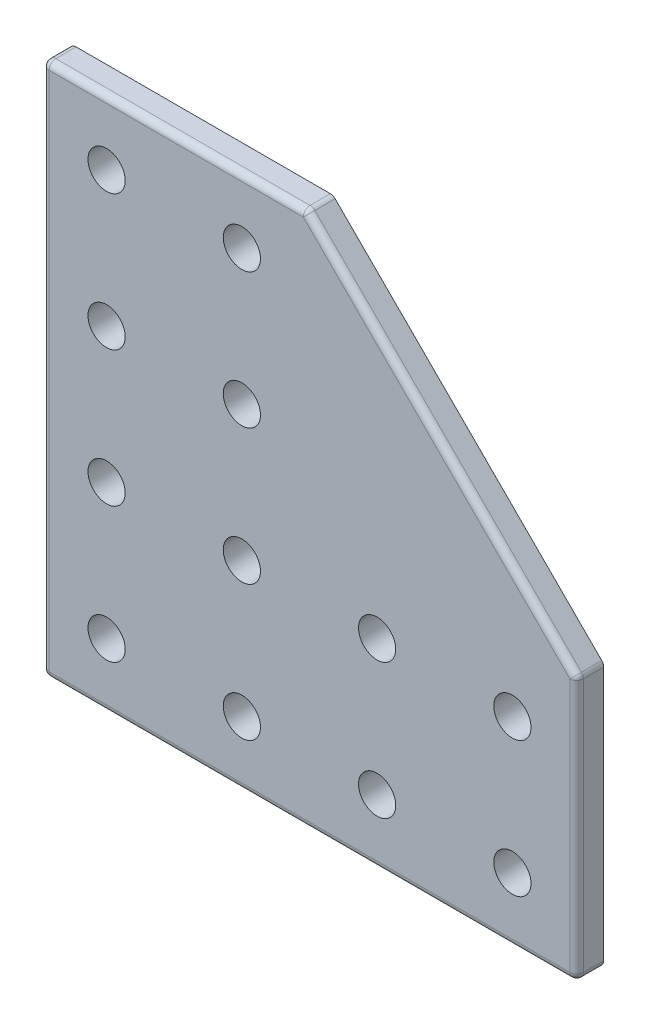
ISO-10303-21;
HEADER;
FILE_DESCRIPTION(('STEP AP214'),'2;1');
FILE_NAME('part.step','',(''),(''),'','','');
FILE_SCHEMA(('AUTOMOTIVE_DESIGN { 1 0 10303 214 1 1 1 1 }'));
ENDSEC;
DATA;
#1=APPLICATION_CONTEXT('core data for automotive mechanical design processes');
#2=APPLICATION_PROTOCOL_DEFINITION('international standard','automotive_design',2000,#1);
#3=PRODUCT_CONTEXT('',#1,'mechanical');
#4=PRODUCT('Part','Part','',(#3));
#5=PRODUCT_RELATED_PRODUCT_CATEGORY('part','',(#4));
#6=PRODUCT_DEFINITION_FORMATION('','',#4);
#7=PRODUCT_DEFINITION_CONTEXT('part definition',#1,'design');
#8=PRODUCT_DEFINITION('design','',#6,#7);
#9=PRODUCT_DEFINITION_SHAPE('','',#8);
#10=(LENGTH_UNIT() NAMED_UNIT(*) SI_UNIT(.MILLI.,.METRE.));
#11=(NAMED_UNIT(*) PLANE_ANGLE_UNIT() SI_UNIT($,.RADIAN.));
#12=(NAMED_UNIT(*) SI_UNIT($,.STERADIAN.) SOLID_ANGLE_UNIT());
#13=UNCERTAINTY_MEASURE_WITH_UNIT(LENGTH_MEASURE(1.E-05),#10,'distance_accuracy_value','');
#14=(GEOMETRIC_REPRESENTATION_CONTEXT(3) GLOBAL_UNCERTAINTY_ASSIGNED_CONTEXT((#13)) GLOBAL_UNIT_ASSIGNED_CONTEXT((#10,
#11,#12)) REPRESENTATION_CONTEXT('',''));
#15=CARTESIAN_POINT('',(0.,0.,0.));
#16=DIRECTION('',(0.,0.,1.));
#17=DIRECTION('',(1.,0.,0.));
#18=AXIS2_PLACEMENT_3D('',#15,#16,#17);
#19=CARTESIAN_POINT('',(0.,0.,2.));
#20=DIRECTION('',(0.,0.,-1.));
#21=DIRECTION('',(-1.,0.,0.));
#22=AXIS2_PLACEMENT_3D('',#19,#20,#21);
#23=PLANE('',#22);
#24=DIRECTION('',(0.,-1.,0.));
#25=VECTOR('',#24,1.);
#26=CARTESIAN_POINT('',(1.,0.,2.));
#27=LINE('',#26,#25);
#28=CARTESIAN_POINT('',(1.,78.,2.));
#29=VERTEX_POINT('',#28);
#30=CARTESIAN_POINT('',(1.,1.,2.));
#31=VERTEX_POINT('',#30);
#32=EDGE_CURVE('E175',#29,#31,#27,.T.);
#33=ORIENTED_EDGE('',*,*,#32,.T.);
#34=DIRECTION('',(1.,0.,0.));
#35=VECTOR('',#34,1.);
#36=CARTESIAN_POINT('',(0.,1.,2.));
#37=LINE('',#36,#35);
#38=CARTESIAN_POINT('',(78.,1.,2.));
#39=VERTEX_POINT('',#38);
#40=EDGE_CURVE('E182',#31,#39,#37,.T.);
#41=ORIENTED_EDGE('',*,*,#40,.T.);
#42=DIRECTION('',(0.,1.,0.));
#43=VECTOR('',#42,1.);
#44=CARTESIAN_POINT('',(78.,0.,2.));
#45=LINE('',#44,#43);
#46=CARTESIAN_POINT('',(78.,38.5857864376269,2.));
#47=VERTEX_POINT('',#46);
#48=EDGE_CURVE('E180',#39,#47,#45,.T.);
#49=ORIENTED_EDGE('',*,*,#48,.T.);
#50=DIRECTION('',(-0.707106781186547,0.707106781186548,0.));
#51=VECTOR('',#50,1.);
#52=CARTESIAN_POINT('',(58.2928932188135,58.2928932188134,2.));
#53=LINE('',#52,#51);
#54=CARTESIAN_POINT('',(38.5857864376269,78.,2.));
#55=VERTEX_POINT('',#54);
#56=EDGE_CURVE('E177',#47,#55,#53,.T.);
#57=ORIENTED_EDGE('',*,*,#56,.T.);
#58=DIRECTION('',(-1.,0.,0.));
#59=VECTOR('',#58,1.);
#60=CARTESIAN_POINT('',(0.,78.,2.));
#61=LINE('',#60,#59);
#62=EDGE_CURVE('E173',#55,#29,#61,.T.);
#63=ORIENTED_EDGE('',*,*,#62,.T.);
#64=EDGE_LOOP('',(#33,#41,#49,#57,#63));
#65=FACE_BOUND('',#64,.T.);
#66=CARTESIAN_POINT('',(29.5,69.5,2.));
#67=DIRECTION('',(0.,0.,1.));
#68=DIRECTION('',(1.,0.,0.));
#69=AXIS2_PLACEMENT_3D('',#66,#67,#68);
#70=CIRCLE('',#69,2.75);
#71=CARTESIAN_POINT('',(32.25,69.5,2.));
#72=VERTEX_POINT('',#71);
#73=EDGE_CURVE('E252',#72,#72,#70,.T.);
#74=ORIENTED_EDGE('',*,*,#73,.F.);
#75=EDGE_LOOP('',(#74));
#76=FACE_BOUND('',#75,.T.);
#77=CARTESIAN_POINT('',(29.5,29.5,2.));
#78=DIRECTION('',(0.,0.,1.));
#79=DIRECTION('',(1.,0.,0.));
#80=AXIS2_PLACEMENT_3D('',#77,#78,#79);
#81=CIRCLE('',#80,2.75);
#82=CARTESIAN_POINT('',(32.25,29.5,2.));
#83=VERTEX_POINT('',#82);
#84=EDGE_CURVE('E264',#83,#83,#81,.T.);
#85=ORIENTED_EDGE('',*,*,#84,.F.);
#86=EDGE_LOOP('',(#85));
#87=FACE_BOUND('',#86,.T.);
#88=CARTESIAN_POINT('',(69.5,29.5,2.));
#89=DIRECTION('',(0.,0.,1.));
#90=DIRECTION('',(1.,0.,0.));
#91=AXIS2_PLACEMENT_3D('',#88,#89,#90);
#92=CIRCLE('',#91,2.75000000000001);
#93=CARTESIAN_POINT('',(72.25,29.5,2.));
#94=VERTEX_POINT('',#93);
#95=EDGE_CURVE('E276',#94,#94,#92,.T.);
#96=ORIENTED_EDGE('',*,*,#95,.F.);
#97=EDGE_LOOP('',(#96));
#98=FACE_BOUND('',#97,.T.);
#99=CARTESIAN_POINT('',(9.50000000000001,49.5,2.));
#100=DIRECTION('',(0.,0.,1.));
#101=DIRECTION('',(1.,0.,0.));
#102=AXIS2_PLACEMENT_3D('',#99,#100,#101);
#103=CIRCLE('',#102,2.75);
#104=CARTESIAN_POINT('',(12.25,49.5,2.));
#105=VERTEX_POINT('',#104);
#106=EDGE_CURVE('E288',#105,#105,#103,.T.);
#107=ORIENTED_EDGE('',*,*,#106,.F.);
#108=EDGE_LOOP('',(#107));
#109=FACE_BOUND('',#108,.T.);
#110=CARTESIAN_POINT('',(49.5,9.49999999999999,2.));
#111=DIRECTION('',(0.,0.,1.));
#112=DIRECTION('',(1.,0.,0.));
#113=AXIS2_PLACEMENT_3D('',#110,#111,#112);
#114=CIRCLE('',#113,2.75000000000001);
#115=CARTESIAN_POINT('',(52.25,9.49999999999999,2.));
#116=VERTEX_POINT('',#115);
#117=EDGE_CURVE('E300',#116,#116,#114,.T.);
#118=ORIENTED_EDGE('',*,*,#117,.F.);
#119=EDGE_LOOP('',(#118));
#120=FACE_BOUND('',#119,.T.);
#121=CARTESIAN_POINT('',(9.5,9.49999999999999,2.));
#122=DIRECTION('',(0.,0.,1.));
#123=DIRECTION('',(1.,0.,0.));
#124=AXIS2_PLACEMENT_3D('',#121,#122,#123);
#125=CIRCLE('',#124,2.75);
#126=CARTESIAN_POINT('',(12.25,9.49999999999999,2.));
#127=VERTEX_POINT('',#126);
#128=EDGE_CURVE('E312',#127,#127,#125,.T.);
#129=ORIENTED_EDGE('',*,*,#128,.F.);
#130=EDGE_LOOP('',(#129));
#131=FACE_BOUND('',#130,.T.);
#132=CARTESIAN_POINT('',(29.5,9.49999999999999,2.));
#133=DIRECTION('',(0.,0.,1.));
#134=DIRECTION('',(1.,0.,0.));
#135=AXIS2_PLACEMENT_3D('',#132,#133,#134);
#136=CIRCLE('',#135,2.75);
#137=CARTESIAN_POINT('',(32.25,9.49999999999999,2.));
#138=VERTEX_POINT('',#137);
#139=EDGE_CURVE('E306',#138,#138,#136,.T.);
#140=ORIENTED_EDGE('',*,*,#139,.F.);
#141=EDGE_LOOP('',(#140));
#142=FACE_BOUND('',#141,.T.);
#143=CARTESIAN_POINT('',(9.5,29.5,2.));
#144=DIRECTION('',(0.,0.,1.));
#145=DIRECTION('',(1.,0.,0.));
#146=AXIS2_PLACEMENT_3D('',#143,#144,#145);
#147=CIRCLE('',#146,2.75000000000001);
#148=CARTESIAN_POINT('',(12.25,29.5,2.));
#149=VERTEX_POINT('',#148);
#150=EDGE_CURVE('E294',#149,#149,#147,.T.);
#151=ORIENTED_EDGE('',*,*,#150,.F.);
#152=EDGE_LOOP('',(#151));
#153=FACE_BOUND('',#152,.T.);
#154=CARTESIAN_POINT('',(69.5,9.49999999999999,2.));
#155=DIRECTION('',(0.,0.,1.));
#156=DIRECTION('',(1.,0.,0.));
#157=AXIS2_PLACEMENT_3D('',#154,#155,#156);
#158=CIRCLE('',#157,2.75000000000001);
#159=CARTESIAN_POINT('',(72.25,9.49999999999999,2.));
#160=VERTEX_POINT('',#159);
#161=EDGE_CURVE('E282',#160,#160,#158,.T.);
#162=ORIENTED_EDGE('',*,*,#161,.F.);
#163=EDGE_LOOP('',(#162));
#164=FACE_BOUND('',#163,.T.);
#165=CARTESIAN_POINT('',(49.5,29.5,2.));
#166=DIRECTION('',(0.,0.,1.));
#167=DIRECTION('',(1.,0.,0.));
#168=AXIS2_PLACEMENT_3D('',#165,#166,#167);
#169=CIRCLE('',#168,2.75);
#170=CARTESIAN_POINT('',(52.25,29.5,2.));
#171=VERTEX_POINT('',#170);
#172=EDGE_CURVE('E270',#171,#171,#169,.T.);
#173=ORIENTED_EDGE('',*,*,#172,.F.);
#174=EDGE_LOOP('',(#173));
#175=FACE_BOUND('',#174,.T.);
#176=CARTESIAN_POINT('',(29.5,49.5,2.));
#177=DIRECTION('',(0.,0.,1.));
#178=DIRECTION('',(1.,0.,0.));
#179=AXIS2_PLACEMENT_3D('',#176,#177,#178);
#180=CIRCLE('',#179,2.75);
#181=CARTESIAN_POINT('',(32.25,49.5,2.));
#182=VERTEX_POINT('',#181);
#183=EDGE_CURVE('E258',#182,#182,#180,.T.);
#184=ORIENTED_EDGE('',*,*,#183,.F.);
#185=EDGE_LOOP('',(#184));
#186=FACE_BOUND('',#185,.T.);
#187=CARTESIAN_POINT('',(9.5,69.5,2.));
#188=DIRECTION('',(0.,0.,1.));
#189=DIRECTION('',(1.,0.,0.));
#190=AXIS2_PLACEMENT_3D('',#187,#188,#189);
#191=CIRCLE('',#190,2.75);
#192=CARTESIAN_POINT('',(12.25,69.5,2.));
#193=VERTEX_POINT('',#192);
#194=EDGE_CURVE('E244',#193,#193,#191,.T.);
#195=ORIENTED_EDGE('',*,*,#194,.F.);
#196=EDGE_LOOP('',(#195));
#197=FACE_BOUND('',#196,.T.);
#198=ADVANCED_FACE('F32',(#65,#76,#87,#98,#109,#120,#131,#142,#153,#164,#175,#186,#197),#23,.F.);
#199=CARTESIAN_POINT('',(0.,0.,-2.));
#200=DIRECTION('',(0.,0.,-1.));
#201=DIRECTION('',(-1.,0.,0.));
#202=AXIS2_PLACEMENT_3D('',#199,#200,#201);
#203=PLANE('',#202);
#204=CARTESIAN_POINT('',(29.5,69.5,-2.));
#205=DIRECTION('',(0.,0.,1.));
#206=DIRECTION('',(1.,0.,0.));
#207=AXIS2_PLACEMENT_3D('',#204,#205,#206);
#208=CIRCLE('',#207,2.75);
#209=CARTESIAN_POINT('',(32.25,69.5,-2.));
#210=VERTEX_POINT('',#209);
#211=EDGE_CURVE('E249',#210,#210,#208,.T.);
#212=ORIENTED_EDGE('',*,*,#211,.T.);
#213=EDGE_LOOP('',(#212));
#214=FACE_BOUND('',#213,.T.);
#215=CARTESIAN_POINT('',(29.5,29.5,-2.));
#216=DIRECTION('',(0.,0.,1.));
#217=DIRECTION('',(1.,0.,0.));
#218=AXIS2_PLACEMENT_3D('',#215,#216,#217);
#219=CIRCLE('',#218,2.75);
#220=CARTESIAN_POINT('',(32.25,29.5,-2.));
#221=VERTEX_POINT('',#220);
#222=EDGE_CURVE('E261',#221,#221,#219,.T.);
#223=ORIENTED_EDGE('',*,*,#222,.T.);
#224=EDGE_LOOP('',(#223));
#225=FACE_BOUND('',#224,.T.);
#226=CARTESIAN_POINT('',(69.5,29.5,-2.));
#227=DIRECTION('',(0.,0.,1.));
#228=DIRECTION('',(1.,0.,0.));
#229=AXIS2_PLACEMENT_3D('',#226,#227,#228);
#230=CIRCLE('',#229,2.75000000000001);
#231=CARTESIAN_POINT('',(72.25,29.5,-2.));
#232=VERTEX_POINT('',#231);
#233=EDGE_CURVE('E273',#232,#232,#230,.T.);
#234=ORIENTED_EDGE('',*,*,#233,.T.);
#235=EDGE_LOOP('',(#234));
#236=FACE_BOUND('',#235,.T.);
#237=CARTESIAN_POINT('',(9.50000000000001,49.5,-2.));
#238=DIRECTION('',(0.,0.,1.));
#239=DIRECTION('',(1.,0.,0.));
#240=AXIS2_PLACEMENT_3D('',#237,#238,#239);
#241=CIRCLE('',#240,2.75);
#242=CARTESIAN_POINT('',(12.25,49.5,-2.));
#243=VERTEX_POINT('',#242);
#244=EDGE_CURVE('E285',#243,#243,#241,.T.);
#245=ORIENTED_EDGE('',*,*,#244,.T.);
#246=EDGE_LOOP('',(#245));
#247=FACE_BOUND('',#246,.T.);
#248=CARTESIAN_POINT('',(49.5,9.49999999999999,-2.));
#249=DIRECTION('',(0.,0.,1.));
#250=DIRECTION('',(1.,0.,0.));
#251=AXIS2_PLACEMENT_3D('',#248,#249,#250);
#252=CIRCLE('',#251,2.75000000000001);
#253=CARTESIAN_POINT('',(52.25,9.49999999999999,-2.));
#254=VERTEX_POINT('',#253);
#255=EDGE_CURVE('E297',#254,#254,#252,.T.);
#256=ORIENTED_EDGE('',*,*,#255,.T.);
#257=EDGE_LOOP('',(#256));
#258=FACE_BOUND('',#257,.T.);
#259=CARTESIAN_POINT('',(9.5,9.49999999999999,-2.));
#260=DIRECTION('',(0.,0.,1.));
#261=DIRECTION('',(1.,0.,0.));
#262=AXIS2_PLACEMENT_3D('',#259,#260,#261);
#263=CIRCLE('',#262,2.75);
#264=CARTESIAN_POINT('',(12.25,9.49999999999999,-2.));
#265=VERTEX_POINT('',#264);
#266=EDGE_CURVE('E309',#265,#265,#263,.T.);
#267=ORIENTED_EDGE('',*,*,#266,.T.);
#268=EDGE_LOOP('',(#267));
#269=FACE_BOUND('',#268,.T.);
#270=DIRECTION('',(-0.707106781186547,0.707106781186548,0.));
#271=VECTOR('',#270,1.);
#272=CARTESIAN_POINT('',(39.,79.,-2.));
#273=LINE('',#272,#271);
#274=CARTESIAN_POINT('',(78.7071067811865,39.2928932188134,-2.));
#275=VERTEX_POINT('',#274);
#276=CARTESIAN_POINT('',(39.2928932188134,78.7071067811865,-2.));
#277=VERTEX_POINT('',#276);
#278=EDGE_CURVE('E138',#275,#277,#273,.T.);
#279=ORIENTED_EDGE('',*,*,#278,.F.);
#280=CARTESIAN_POINT('',(78.,38.5857864376269,-2.));
#281=DIRECTION('',(0.,0.,-1.));
#282=DIRECTION('',(-1.,0.,0.));
#283=AXIS2_PLACEMENT_3D('',#280,#281,#282);
#284=CIRCLE('',#283,1.);
#285=CARTESIAN_POINT('',(79.,38.5857864376269,-2.));
#286=VERTEX_POINT('',#285);
#287=EDGE_CURVE('E122',#275,#286,#284,.T.);
#288=ORIENTED_EDGE('',*,*,#287,.T.);
#289=DIRECTION('',(0.,1.,0.));
#290=VECTOR('',#289,1.);
#291=CARTESIAN_POINT('',(79.,39.,-2.));
#292=LINE('',#291,#290);
#293=CARTESIAN_POINT('',(79.,1.,-2.));
#294=VERTEX_POINT('',#293);
#295=EDGE_CURVE('E150',#294,#286,#292,.T.);
#296=ORIENTED_EDGE('',*,*,#295,.F.);
#297=CARTESIAN_POINT('',(78.,1.,-2.));
#298=DIRECTION('',(0.,0.,-1.));
#299=DIRECTION('',(-1.,0.,0.));
#300=AXIS2_PLACEMENT_3D('',#297,#298,#299);
#301=CIRCLE('',#300,1.);
#302=CARTESIAN_POINT('',(78.,0.,-2.));
#303=VERTEX_POINT('',#302);
#304=EDGE_CURVE('E164',#294,#303,#301,.T.);
#305=ORIENTED_EDGE('',*,*,#304,.T.);
#306=DIRECTION('',(1.,0.,0.));
#307=VECTOR('',#306,1.);
#308=CARTESIAN_POINT('',(79.,0.,-2.));
#309=LINE('',#308,#307);
#310=CARTESIAN_POINT('',(1.,0.,-2.));
#311=VERTEX_POINT('',#310);
#312=EDGE_CURVE('E155',#311,#303,#309,.T.);
#313=ORIENTED_EDGE('',*,*,#312,.F.);
#314=CARTESIAN_POINT('',(1.,1.,-2.));
#315=DIRECTION('',(0.,0.,-1.));
#316=DIRECTION('',(-1.,0.,0.));
#317=AXIS2_PLACEMENT_3D('',#314,#315,#316);
#318=CIRCLE('',#317,1.);
#319=CARTESIAN_POINT('',(0.,1.,-2.));
#320=VERTEX_POINT('',#319);
#321=EDGE_CURVE('E166',#311,#320,#318,.T.);
#322=ORIENTED_EDGE('',*,*,#321,.T.);
#323=DIRECTION('',(0.,-1.,0.));
#324=VECTOR('',#323,1.);
#325=CARTESIAN_POINT('',(0.,0.,-2.));
#326=LINE('',#325,#324);
#327=CARTESIAN_POINT('',(0.,78.,-2.));
#328=VERTEX_POINT('',#327);
#329=EDGE_CURVE('E153',#328,#320,#326,.T.);
#330=ORIENTED_EDGE('',*,*,#329,.F.);
#331=CARTESIAN_POINT('',(1.,78.,-2.));
#332=DIRECTION('',(0.,0.,-1.));
#333=DIRECTION('',(-1.,0.,0.));
#334=AXIS2_PLACEMENT_3D('',#331,#332,#333);
#335=CIRCLE('',#334,1.);
#336=CARTESIAN_POINT('',(1.,79.,-2.));
#337=VERTEX_POINT('',#336);
#338=EDGE_CURVE('E143',#328,#337,#335,.T.);
#339=ORIENTED_EDGE('',*,*,#338,.T.);
#340=DIRECTION('',(-1.,0.,0.));
#341=VECTOR('',#340,1.);
#342=CARTESIAN_POINT('',(39.,79.,-2.));
#343=LINE('',#342,#341);
#344=CARTESIAN_POINT('',(38.5857864376269,79.,-2.));
#345=VERTEX_POINT('',#344);
#346=EDGE_CURVE('E149',#345,#337,#343,.T.);
#347=ORIENTED_EDGE('',*,*,#346,.F.);
#348=CARTESIAN_POINT('',(38.5857864376269,78.,-2.));
#349=DIRECTION('',(0.,0.,-1.));
#350=DIRECTION('',(-1.,0.,0.));
#351=AXIS2_PLACEMENT_3D('',#348,#349,#350);
#352=CIRCLE('',#351,1.);
#353=EDGE_CURVE('E133',#345,#277,#352,.T.);
#354=ORIENTED_EDGE('',*,*,#353,.T.);
#355=EDGE_LOOP('',(#279,#288,#296,#305,#313,#322,#330,#339,#347,#354));
#356=FACE_BOUND('',#355,.T.);
#357=CARTESIAN_POINT('',(29.5,9.49999999999999,-2.));
#358=DIRECTION('',(0.,0.,1.));
#359=DIRECTION('',(1.,0.,0.));
#360=AXIS2_PLACEMENT_3D('',#357,#358,#359);
#361=CIRCLE('',#360,2.75);
#362=CARTESIAN_POINT('',(32.25,9.49999999999999,-2.));
#363=VERTEX_POINT('',#362);
#364=EDGE_CURVE('E303',#363,#363,#361,.T.);
#365=ORIENTED_EDGE('',*,*,#364,.T.);
#366=EDGE_LOOP('',(#365));
#367=FACE_BOUND('',#366,.T.);
#368=CARTESIAN_POINT('',(9.5,29.5,-2.));
#369=DIRECTION('',(0.,0.,1.));
#370=DIRECTION('',(1.,0.,0.));
#371=AXIS2_PLACEMENT_3D('',#368,#369,#370);
#372=CIRCLE('',#371,2.75000000000001);
#373=CARTESIAN_POINT('',(12.25,29.5,-2.));
#374=VERTEX_POINT('',#373);
#375=EDGE_CURVE('E291',#374,#374,#372,.T.);
#376=ORIENTED_EDGE('',*,*,#375,.T.);
#377=EDGE_LOOP('',(#376));
#378=FACE_BOUND('',#377,.T.);
#379=CARTESIAN_POINT('',(69.5,9.49999999999999,-2.));
#380=DIRECTION('',(0.,0.,1.));
#381=DIRECTION('',(1.,0.,0.));
#382=AXIS2_PLACEMENT_3D('',#379,#380,#381);
#383=CIRCLE('',#382,2.75000000000001);
#384=CARTESIAN_POINT('',(72.25,9.49999999999999,-2.));
#385=VERTEX_POINT('',#384);
#386=EDGE_CURVE('E279',#385,#385,#383,.T.);
#387=ORIENTED_EDGE('',*,*,#386,.T.);
#388=EDGE_LOOP('',(#387));
#389=FACE_BOUND('',#388,.T.);
#390=CARTESIAN_POINT('',(49.5,29.5,-2.));
#391=DIRECTION('',(0.,0.,1.));
#392=DIRECTION('',(1.,0.,0.));
#393=AXIS2_PLACEMENT_3D('',#390,#391,#392);
#394=CIRCLE('',#393,2.75);
#395=CARTESIAN_POINT('',(52.25,29.5,-2.));
#396=VERTEX_POINT('',#395);
#397=EDGE_CURVE('E267',#396,#396,#394,.T.);
#398=ORIENTED_EDGE('',*,*,#397,.T.);
#399=EDGE_LOOP('',(#398));
#400=FACE_BOUND('',#399,.T.);
#401=CARTESIAN_POINT('',(29.5,49.5,-2.));
#402=DIRECTION('',(0.,0.,1.));
#403=DIRECTION('',(1.,0.,0.));
#404=AXIS2_PLACEMENT_3D('',#401,#402,#403);
#405=CIRCLE('',#404,2.75);
#406=CARTESIAN_POINT('',(32.25,49.5,-2.));
#407=VERTEX_POINT('',#406);
#408=EDGE_CURVE('E255',#407,#407,#405,.T.);
#409=ORIENTED_EDGE('',*,*,#408,.T.);
#410=EDGE_LOOP('',(#409));
#411=FACE_BOUND('',#410,.T.);
#412=CARTESIAN_POINT('',(9.5,69.5,-2.));
#413=DIRECTION('',(0.,0.,1.));
#414=DIRECTION('',(1.,0.,0.));
#415=AXIS2_PLACEMENT_3D('',#412,#413,#414);
#416=CIRCLE('',#415,2.75);
#417=CARTESIAN_POINT('',(12.25,69.5,-2.));
#418=VERTEX_POINT('',#417);
#419=EDGE_CURVE('E241',#418,#418,#416,.T.);
#420=ORIENTED_EDGE('',*,*,#419,.T.);
#421=EDGE_LOOP('',(#420));
#422=FACE_BOUND('',#421,.T.);
#423=ADVANCED_FACE('F145',(#214,#225,#236,#247,#258,#269,#356,#367,#378,#389,#400,#411,#422),
#203,.T.);
#424=CARTESIAN_POINT('',(79.,0.,2.));
#425=DIRECTION('',(0.,1.,0.));
#426=DIRECTION('',(-1.,0.,0.));
#427=AXIS2_PLACEMENT_3D('',#424,#425,#426);
#428=PLANE('',#427);
#429=DIRECTION('',(1.,0.,0.));
#430=VECTOR('',#429,1.);
#431=CARTESIAN_POINT('',(79.,0.,1.));
#432=LINE('',#431,#430);
#433=CARTESIAN_POINT('',(78.,0.,1.));
#434=VERTEX_POINT('',#433);
#435=CARTESIAN_POINT('',(1.,0.,1.));
#436=VERTEX_POINT('',#435);
#437=EDGE_CURVE('E192',#434,#436,#432,.F.);
#438=ORIENTED_EDGE('',*,*,#437,.T.);
#439=DIRECTION('',(0.,0.,-1.));
#440=VECTOR('',#439,1.);
#441=CARTESIAN_POINT('',(1.,0.,2.));
#442=LINE('',#441,#440);
#443=EDGE_CURVE('E194',#436,#311,#442,.T.);
#444=ORIENTED_EDGE('',*,*,#443,.T.);
#445=ORIENTED_EDGE('',*,*,#312,.T.);
#446=DIRECTION('',(0.,0.,-1.));
#447=VECTOR('',#446,1.);
#448=CARTESIAN_POINT('',(78.,0.,2.));
#449=LINE('',#448,#447);
#450=EDGE_CURVE('E190',#303,#434,#449,.F.);
#451=ORIENTED_EDGE('',*,*,#450,.T.);
#452=EDGE_LOOP('',(#438,#444,#445,#451));
#453=FACE_BOUND('',#452,.T.);
#454=ADVANCED_FACE('F320',(#453),#428,.F.);
#455=CARTESIAN_POINT('',(79.,39.,2.));
#456=DIRECTION('',(-1.,0.,0.));
#457=DIRECTION('',(0.,0.,1.));
#458=AXIS2_PLACEMENT_3D('',#455,#456,#457);
#459=PLANE('',#458);
#460=ORIENTED_EDGE('',*,*,#295,.T.);
#461=DIRECTION('',(0.,0.,-1.));
#462=VECTOR('',#461,1.);
#463=CARTESIAN_POINT('',(79.,38.5857864376269,2.));
#464=LINE('',#463,#462);
#465=CARTESIAN_POINT('',(79.,38.5857864376269,1.));
#466=VERTEX_POINT('',#465);
#467=EDGE_CURVE('E127',#286,#466,#464,.F.);
#468=ORIENTED_EDGE('',*,*,#467,.T.);
#469=DIRECTION('',(0.,1.,0.));
#470=VECTOR('',#469,1.);
#471=CARTESIAN_POINT('',(79.,39.,1.));
#472=LINE('',#471,#470);
#473=CARTESIAN_POINT('',(79.,1.,1.));
#474=VERTEX_POINT('',#473);
#475=EDGE_CURVE('E170',#466,#474,#472,.F.);
#476=ORIENTED_EDGE('',*,*,#475,.T.);
#477=DIRECTION('',(0.,0.,-1.));
#478=VECTOR('',#477,1.);
#479=CARTESIAN_POINT('',(79.,1.,2.));
#480=LINE('',#479,#478);
#481=EDGE_CURVE('E132',#474,#294,#480,.T.);
#482=ORIENTED_EDGE('',*,*,#481,.T.);
#483=EDGE_LOOP('',(#460,#468,#476,#482));
#484=FACE_BOUND('',#483,.T.);
#485=ADVANCED_FACE('F377',(#484),#459,.F.);
#486=CARTESIAN_POINT('',(39.,79.,2.));
#487=DIRECTION('',(-0.707106781186548,-0.707106781186547,0.));
#488=DIRECTION('',(0.707106781186547,-0.707106781186548,0.));
#489=AXIS2_PLACEMENT_3D('',#486,#487,#488);
#490=PLANE('',#489);
#491=DIRECTION('',(-0.707106781186547,0.707106781186548,0.));
#492=VECTOR('',#491,1.);
#493=CARTESIAN_POINT('',(39.,79.,1.));
#494=LINE('',#493,#492);
#495=CARTESIAN_POINT('',(39.2928932188134,78.7071067811865,1.));
#496=VERTEX_POINT('',#495);
#497=CARTESIAN_POINT('',(78.7071067811865,39.2928932188134,1.));
#498=VERTEX_POINT('',#497);
#499=EDGE_CURVE('E141',#496,#498,#494,.F.);
#500=ORIENTED_EDGE('',*,*,#499,.T.);
#501=DIRECTION('',(0.,0.,-1.));
#502=VECTOR('',#501,1.);
#503=CARTESIAN_POINT('',(78.7071067811865,39.2928932188134,2.));
#504=LINE('',#503,#502);
#505=EDGE_CURVE('E126',#498,#275,#504,.T.);
#506=ORIENTED_EDGE('',*,*,#505,.T.);
#507=ORIENTED_EDGE('',*,*,#278,.T.);
#508=DIRECTION('',(0.,0.,-1.));
#509=VECTOR('',#508,1.);
#510=CARTESIAN_POINT('',(39.2928932188134,78.7071067811865,2.));
#511=LINE('',#510,#509);
#512=EDGE_CURVE('E160',#277,#496,#511,.F.);
#513=ORIENTED_EDGE('',*,*,#512,.T.);
#514=EDGE_LOOP('',(#500,#506,#507,#513));
#515=FACE_BOUND('',#514,.T.);
#516=ADVANCED_FACE('F137',(#515),#490,.F.);
#517=CARTESIAN_POINT('',(39.,79.,2.));
#518=DIRECTION('',(0.,-1.,0.));
#519=DIRECTION('',(0.,0.,-1.));
#520=AXIS2_PLACEMENT_3D('',#517,#518,#519);
#521=PLANE('',#520);
#522=DIRECTION('',(-1.,0.,0.));
#523=VECTOR('',#522,1.);
#524=CARTESIAN_POINT('',(39.,79.,1.));
#525=LINE('',#524,#523);
#526=CARTESIAN_POINT('',(1.,79.,1.));
#527=VERTEX_POINT('',#526);
#528=CARTESIAN_POINT('',(38.5857864376269,79.,1.));
#529=VERTEX_POINT('',#528);
#530=EDGE_CURVE('E186',#527,#529,#525,.F.);
#531=ORIENTED_EDGE('',*,*,#530,.T.);
#532=DIRECTION('',(0.,0.,-1.));
#533=VECTOR('',#532,1.);
#534=CARTESIAN_POINT('',(38.5857864376269,79.,2.));
#535=LINE('',#534,#533);
#536=EDGE_CURVE('E188',#529,#345,#535,.T.);
#537=ORIENTED_EDGE('',*,*,#536,.T.);
#538=ORIENTED_EDGE('',*,*,#346,.T.);
#539=DIRECTION('',(0.,0.,-1.));
#540=VECTOR('',#539,1.);
#541=CARTESIAN_POINT('',(1.,79.,2.));
#542=LINE('',#541,#540);
#543=EDGE_CURVE('E184',#337,#527,#542,.F.);
#544=ORIENTED_EDGE('',*,*,#543,.T.);
#545=EDGE_LOOP('',(#531,#537,#538,#544));
#546=FACE_BOUND('',#545,.T.);
#547=ADVANCED_FACE('F359',(#546),#521,.F.);
#548=CARTESIAN_POINT('',(0.,0.,2.));
#549=DIRECTION('',(1.,0.,0.));
#550=DIRECTION('',(0.,0.,-1.));
#551=AXIS2_PLACEMENT_3D('',#548,#549,#550);
#552=PLANE('',#551);
#553=ORIENTED_EDGE('',*,*,#329,.T.);
#554=DIRECTION('',(0.,0.,-1.));
#555=VECTOR('',#554,1.);
#556=CARTESIAN_POINT('',(0.,1.,2.));
#557=LINE('',#556,#555);
#558=CARTESIAN_POINT('',(0.,1.,1.));
#559=VERTEX_POINT('',#558);
#560=EDGE_CURVE('E11',#320,#559,#557,.F.);
#561=ORIENTED_EDGE('',*,*,#560,.T.);
#562=DIRECTION('',(0.,-1.,0.));
#563=VECTOR('',#562,1.);
#564=CARTESIAN_POINT('',(0.,0.,1.));
#565=LINE('',#564,#563);
#566=CARTESIAN_POINT('',(0.,78.,1.));
#567=VERTEX_POINT('',#566);
#568=EDGE_CURVE('E41',#559,#567,#565,.F.);
#569=ORIENTED_EDGE('',*,*,#568,.T.);
#570=DIRECTION('',(0.,0.,-1.));
#571=VECTOR('',#570,1.);
#572=CARTESIAN_POINT('',(0.,78.,2.));
#573=LINE('',#572,#571);
#574=EDGE_CURVE('E196',#567,#328,#573,.T.);
#575=ORIENTED_EDGE('',*,*,#574,.T.);
#576=EDGE_LOOP('',(#553,#561,#569,#575));
#577=FACE_BOUND('',#576,.T.);
#578=ADVANCED_FACE('F340',(#577),#552,.F.);
#579=CARTESIAN_POINT('',(9.5,9.49999999999999,2.));
#580=DIRECTION('',(0.,0.,-1.));
#581=DIRECTION('',(-1.,0.,0.));
#582=AXIS2_PLACEMENT_3D('',#579,#580,#581);
#583=CYLINDRICAL_SURFACE('',#582,2.75);
#584=ORIENTED_EDGE('',*,*,#128,.T.);
#585=EDGE_LOOP('',(#584));
#586=FACE_BOUND('',#585,.T.);
#587=ORIENTED_EDGE('',*,*,#266,.F.);
#588=EDGE_LOOP('',(#587));
#589=FACE_BOUND('',#588,.T.);
#590=ADVANCED_FACE('F396',(#586,#589),#583,.F.);
#591=CARTESIAN_POINT('',(29.5,9.49999999999999,2.));
#592=DIRECTION('',(0.,0.,-1.));
#593=DIRECTION('',(-1.,0.,0.));
#594=AXIS2_PLACEMENT_3D('',#591,#592,#593);
#595=CYLINDRICAL_SURFACE('',#594,2.75);
#596=ORIENTED_EDGE('',*,*,#139,.T.);
#597=EDGE_LOOP('',(#596));
#598=FACE_BOUND('',#597,.T.);
#599=ORIENTED_EDGE('',*,*,#364,.F.);
#600=EDGE_LOOP('',(#599));
#601=FACE_BOUND('',#600,.T.);
#602=ADVANCED_FACE('F417',(#598,#601),#595,.F.);
#603=CARTESIAN_POINT('',(49.5,9.49999999999999,2.));
#604=DIRECTION('',(0.,0.,-1.));
#605=DIRECTION('',(-1.,0.,0.));
#606=AXIS2_PLACEMENT_3D('',#603,#604,#605);
#607=CYLINDRICAL_SURFACE('',#606,2.75000000000001);
#608=ORIENTED_EDGE('',*,*,#117,.T.);
#609=EDGE_LOOP('',(#608));
#610=FACE_BOUND('',#609,.T.);
#611=ORIENTED_EDGE('',*,*,#255,.F.);
#612=EDGE_LOOP('',(#611));
#613=FACE_BOUND('',#612,.T.);
#614=ADVANCED_FACE('F424',(#610,#613),#607,.F.);
#615=CARTESIAN_POINT('',(9.5,29.5,2.));
#616=DIRECTION('',(0.,0.,-1.));
#617=DIRECTION('',(-1.,0.,0.));
#618=AXIS2_PLACEMENT_3D('',#615,#616,#617);
#619=CYLINDRICAL_SURFACE('',#618,2.75000000000001);
#620=ORIENTED_EDGE('',*,*,#150,.T.);
#621=EDGE_LOOP('',(#620));
#622=FACE_BOUND('',#621,.T.);
#623=ORIENTED_EDGE('',*,*,#375,.F.);
#624=EDGE_LOOP('',(#623));
#625=FACE_BOUND('',#624,.T.);
#626=ADVANCED_FACE('F431',(#622,#625),#619,.F.);
#627=CARTESIAN_POINT('',(9.50000000000001,49.5,2.));
#628=DIRECTION('',(0.,0.,-1.));
#629=DIRECTION('',(-1.,0.,0.));
#630=AXIS2_PLACEMENT_3D('',#627,#628,#629);
#631=CYLINDRICAL_SURFACE('',#630,2.75);
#632=ORIENTED_EDGE('',*,*,#106,.T.);
#633=EDGE_LOOP('',(#632));
#634=FACE_BOUND('',#633,.T.);
#635=ORIENTED_EDGE('',*,*,#244,.F.);
#636=EDGE_LOOP('',(#635));
#637=FACE_BOUND('',#636,.T.);
#638=ADVANCED_FACE('F439',(#634,#637),#631,.F.);
#639=CARTESIAN_POINT('',(69.5,9.49999999999999,2.));
#640=DIRECTION('',(0.,0.,-1.));
#641=DIRECTION('',(-1.,0.,0.));
#642=AXIS2_PLACEMENT_3D('',#639,#640,#641);
#643=CYLINDRICAL_SURFACE('',#642,2.75000000000001);
#644=ORIENTED_EDGE('',*,*,#161,.T.);
#645=EDGE_LOOP('',(#644));
#646=FACE_BOUND('',#645,.T.);
#647=ORIENTED_EDGE('',*,*,#386,.F.);
#648=EDGE_LOOP('',(#647));
#649=FACE_BOUND('',#648,.T.);
#650=ADVANCED_FACE('F447',(#646,#649),#643,.F.);
#651=CARTESIAN_POINT('',(69.5,29.5,2.));
#652=DIRECTION('',(0.,0.,-1.));
#653=DIRECTION('',(-1.,0.,0.));
#654=AXIS2_PLACEMENT_3D('',#651,#652,#653);
#655=CYLINDRICAL_SURFACE('',#654,2.75000000000001);
#656=ORIENTED_EDGE('',*,*,#95,.T.);
#657=EDGE_LOOP('',(#656));
#658=FACE_BOUND('',#657,.T.);
#659=ORIENTED_EDGE('',*,*,#233,.F.);
#660=EDGE_LOOP('',(#659));
#661=FACE_BOUND('',#660,.T.);
#662=ADVANCED_FACE('F455',(#658,#661),#655,.F.);
#663=CARTESIAN_POINT('',(49.5,29.5,2.));
#664=DIRECTION('',(0.,0.,-1.));
#665=DIRECTION('',(-1.,0.,0.));
#666=AXIS2_PLACEMENT_3D('',#663,#664,#665);
#667=CYLINDRICAL_SURFACE('',#666,2.75);
#668=ORIENTED_EDGE('',*,*,#172,.T.);
#669=EDGE_LOOP('',(#668));
#670=FACE_BOUND('',#669,.T.);
#671=ORIENTED_EDGE('',*,*,#397,.F.);
#672=EDGE_LOOP('',(#671));
#673=FACE_BOUND('',#672,.T.);
#674=ADVANCED_FACE('F463',(#670,#673),#667,.F.);
#675=CARTESIAN_POINT('',(29.5,29.5,2.));
#676=DIRECTION('',(0.,0.,-1.));
#677=DIRECTION('',(-1.,0.,0.));
#678=AXIS2_PLACEMENT_3D('',#675,#676,#677);
#679=CYLINDRICAL_SURFACE('',#678,2.75);
#680=ORIENTED_EDGE('',*,*,#84,.T.);
#681=EDGE_LOOP('',(#680));
#682=FACE_BOUND('',#681,.T.);
#683=ORIENTED_EDGE('',*,*,#222,.F.);
#684=EDGE_LOOP('',(#683));
#685=FACE_BOUND('',#684,.T.);
#686=ADVANCED_FACE('F471',(#682,#685),#679,.F.);
#687=CARTESIAN_POINT('',(29.5,49.5,2.));
#688=DIRECTION('',(0.,0.,-1.));
#689=DIRECTION('',(-1.,0.,0.));
#690=AXIS2_PLACEMENT_3D('',#687,#688,#689);
#691=CYLINDRICAL_SURFACE('',#690,2.75);
#692=ORIENTED_EDGE('',*,*,#183,.T.);
#693=EDGE_LOOP('',(#692));
#694=FACE_BOUND('',#693,.T.);
#695=ORIENTED_EDGE('',*,*,#408,.F.);
#696=EDGE_LOOP('',(#695));
#697=FACE_BOUND('',#696,.T.);
#698=ADVANCED_FACE('F479',(#694,#697),#691,.F.);
#699=CARTESIAN_POINT('',(29.5,69.5,2.));
#700=DIRECTION('',(0.,0.,-1.));
#701=DIRECTION('',(-1.,0.,0.));
#702=AXIS2_PLACEMENT_3D('',#699,#700,#701);
#703=CYLINDRICAL_SURFACE('',#702,2.75);
#704=ORIENTED_EDGE('',*,*,#73,.T.);
#705=EDGE_LOOP('',(#704));
#706=FACE_BOUND('',#705,.T.);
#707=ORIENTED_EDGE('',*,*,#211,.F.);
#708=EDGE_LOOP('',(#707));
#709=FACE_BOUND('',#708,.T.);
#710=ADVANCED_FACE('F487',(#706,#709),#703,.F.);
#711=CARTESIAN_POINT('',(9.5,69.5,2.));
#712=DIRECTION('',(0.,0.,-1.));
#713=DIRECTION('',(-1.,0.,0.));
#714=AXIS2_PLACEMENT_3D('',#711,#712,#713);
#715=CYLINDRICAL_SURFACE('',#714,2.75);
#716=ORIENTED_EDGE('',*,*,#194,.T.);
#717=EDGE_LOOP('',(#716));
#718=FACE_BOUND('',#717,.T.);
#719=ORIENTED_EDGE('',*,*,#419,.F.);
#720=EDGE_LOOP('',(#719));
#721=FACE_BOUND('',#720,.T.);
#722=ADVANCED_FACE('F495',(#718,#721),#715,.F.);
#723=CARTESIAN_POINT('',(1.,1.,2.));
#724=DIRECTION('',(0.,0.,-1.));
#725=DIRECTION('',(-1.,0.,0.));
#726=AXIS2_PLACEMENT_3D('',#723,#724,#725);
#727=CYLINDRICAL_SURFACE('',#726,1.);
#728=ORIENTED_EDGE('',*,*,#321,.F.);
#729=ORIENTED_EDGE('',*,*,#443,.F.);
#730=CARTESIAN_POINT('',(1.,1.,1.));
#731=DIRECTION('',(0.,0.,1.));
#732=DIRECTION('',(1.,0.,0.));
#733=AXIS2_PLACEMENT_3D('',#730,#731,#732);
#734=CIRCLE('',#733,1.);
#735=EDGE_CURVE('E36',#559,#436,#734,.T.);
#736=ORIENTED_EDGE('',*,*,#735,.F.);
#737=ORIENTED_EDGE('',*,*,#560,.F.);
#738=EDGE_LOOP('',(#728,#729,#736,#737));
#739=FACE_BOUND('',#738,.T.);
#740=ADVANCED_FACE('F34',(#739),#727,.T.);
#741=CARTESIAN_POINT('',(1.,0.,1.));
#742=DIRECTION('',(0.,-1.,0.));
#743=DIRECTION('',(0.,0.,-1.));
#744=AXIS2_PLACEMENT_3D('',#741,#742,#743);
#745=CYLINDRICAL_SURFACE('',#744,1.);
#746=CARTESIAN_POINT('',(1.,78.,1.));
#747=DIRECTION('',(0.,1.,0.));
#748=DIRECTION('',(0.,0.,1.));
#749=AXIS2_PLACEMENT_3D('',#746,#747,#748);
#750=CIRCLE('',#749,1.);
#751=EDGE_CURVE('E233',#567,#29,#750,.T.);
#752=ORIENTED_EDGE('',*,*,#751,.F.);
#753=ORIENTED_EDGE('',*,*,#568,.F.);
#754=CARTESIAN_POINT('',(1.,1.,1.));
#755=DIRECTION('',(0.,-1.,0.));
#756=DIRECTION('',(0.,0.,-1.));
#757=AXIS2_PLACEMENT_3D('',#754,#755,#756);
#758=CIRCLE('',#757,1.);
#759=EDGE_CURVE('E235',#31,#559,#758,.T.);
#760=ORIENTED_EDGE('',*,*,#759,.F.);
#761=ORIENTED_EDGE('',*,*,#32,.F.);
#762=EDGE_LOOP('',(#752,#753,#760,#761));
#763=FACE_BOUND('',#762,.T.);
#764=ADVANCED_FACE('F349',(#763),#745,.T.);
#765=CARTESIAN_POINT('',(1.,78.,2.));
#766=DIRECTION('',(0.,0.,-1.));
#767=DIRECTION('',(-1.,0.,0.));
#768=AXIS2_PLACEMENT_3D('',#765,#766,#767);
#769=CYLINDRICAL_SURFACE('',#768,1.);
#770=ORIENTED_EDGE('',*,*,#338,.F.);
#771=ORIENTED_EDGE('',*,*,#574,.F.);
#772=CARTESIAN_POINT('',(1.,78.,1.));
#773=DIRECTION('',(0.,0.,1.));
#774=DIRECTION('',(1.,0.,0.));
#775=AXIS2_PLACEMENT_3D('',#772,#773,#774);
#776=CIRCLE('',#775,1.);
#777=EDGE_CURVE('E230',#527,#567,#776,.T.);
#778=ORIENTED_EDGE('',*,*,#777,.F.);
#779=ORIENTED_EDGE('',*,*,#543,.F.);
#780=EDGE_LOOP('',(#770,#771,#778,#779));
#781=FACE_BOUND('',#780,.T.);
#782=ADVANCED_FACE('F344',(#781),#769,.T.);
#783=CARTESIAN_POINT('',(1.,1.,1.));
#784=DIRECTION('',(0.,0.,1.));
#785=DIRECTION('',(1.,0.,0.));
#786=AXIS2_PLACEMENT_3D('',#783,#784,#785);
#787=SPHERICAL_SURFACE('',#786,1.);
#788=ORIENTED_EDGE('',*,*,#759,.T.);
#789=ORIENTED_EDGE('',*,*,#735,.T.);
#790=CARTESIAN_POINT('',(1.,1.,1.));
#791=DIRECTION('',(-1.,0.,0.));
#792=DIRECTION('',(0.,0.,1.));
#793=AXIS2_PLACEMENT_3D('',#790,#791,#792);
#794=CIRCLE('',#793,1.);
#795=EDGE_CURVE('E227',#31,#436,#794,.F.);
#796=ORIENTED_EDGE('',*,*,#795,.F.);
#797=EDGE_LOOP('',(#788,#789,#796));
#798=FACE_BOUND('',#797,.T.);
#799=ADVANCED_FACE('F519',(#798),#787,.T.);
#800=CARTESIAN_POINT('',(1.,78.,1.));
#801=DIRECTION('',(0.,0.,1.));
#802=DIRECTION('',(1.,0.,0.));
#803=AXIS2_PLACEMENT_3D('',#800,#801,#802);
#804=SPHERICAL_SURFACE('',#803,1.);
#805=ORIENTED_EDGE('',*,*,#777,.T.);
#806=ORIENTED_EDGE('',*,*,#751,.T.);
#807=CARTESIAN_POINT('',(1.,78.,1.));
#808=DIRECTION('',(-1.,0.,0.));
#809=DIRECTION('',(0.,0.,1.));
#810=AXIS2_PLACEMENT_3D('',#807,#808,#809);
#811=CIRCLE('',#810,1.);
#812=EDGE_CURVE('E224',#527,#29,#811,.F.);
#813=ORIENTED_EDGE('',*,*,#812,.F.);
#814=EDGE_LOOP('',(#805,#806,#813));
#815=FACE_BOUND('',#814,.T.);
#816=ADVANCED_FACE('F351',(#815),#804,.T.);
#817=CARTESIAN_POINT('',(78.,1.,2.));
#818=DIRECTION('',(0.,0.,-1.));
#819=DIRECTION('',(-1.,0.,0.));
#820=AXIS2_PLACEMENT_3D('',#817,#818,#819);
#821=CYLINDRICAL_SURFACE('',#820,1.);
#822=ORIENTED_EDGE('',*,*,#304,.F.);
#823=ORIENTED_EDGE('',*,*,#481,.F.);
#824=CARTESIAN_POINT('',(78.,1.,1.));
#825=DIRECTION('',(0.,0.,1.));
#826=DIRECTION('',(1.,0.,0.));
#827=AXIS2_PLACEMENT_3D('',#824,#825,#826);
#828=CIRCLE('',#827,1.);
#829=EDGE_CURVE('E221',#434,#474,#828,.T.);
#830=ORIENTED_EDGE('',*,*,#829,.F.);
#831=ORIENTED_EDGE('',*,*,#450,.F.);
#832=EDGE_LOOP('',(#822,#823,#830,#831));
#833=FACE_BOUND('',#832,.T.);
#834=ADVANCED_FACE('F327',(#833),#821,.T.);
#835=CARTESIAN_POINT('',(0.,1.,1.));
#836=DIRECTION('',(1.,0.,0.));
#837=DIRECTION('',(0.,1.,0.));
#838=AXIS2_PLACEMENT_3D('',#835,#836,#837);
#839=CYLINDRICAL_SURFACE('',#838,1.);
#840=ORIENTED_EDGE('',*,*,#795,.T.);
#841=ORIENTED_EDGE('',*,*,#437,.F.);
#842=CARTESIAN_POINT('',(78.,1.,1.));
#843=DIRECTION('',(1.,0.,0.));
#844=DIRECTION('',(0.,0.,-1.));
#845=AXIS2_PLACEMENT_3D('',#842,#843,#844);
#846=CIRCLE('',#845,1.);
#847=EDGE_CURVE('E218',#39,#434,#846,.T.);
#848=ORIENTED_EDGE('',*,*,#847,.F.);
#849=ORIENTED_EDGE('',*,*,#40,.F.);
#850=EDGE_LOOP('',(#840,#841,#848,#849));
#851=FACE_BOUND('',#850,.T.);
#852=ADVANCED_FACE('F336',(#851),#839,.T.);
#853=CARTESIAN_POINT('',(0.,78.,1.));
#854=DIRECTION('',(-1.,0.,0.));
#855=DIRECTION('',(0.,0.,1.));
#856=AXIS2_PLACEMENT_3D('',#853,#854,#855);
#857=CYLINDRICAL_SURFACE('',#856,1.);
#858=ORIENTED_EDGE('',*,*,#812,.T.);
#859=ORIENTED_EDGE('',*,*,#62,.F.);
#860=CARTESIAN_POINT('',(38.5857864376269,78.,1.));
#861=DIRECTION('',(1.,0.,0.));
#862=DIRECTION('',(0.,0.,-1.));
#863=AXIS2_PLACEMENT_3D('',#860,#861,#862);
#864=CIRCLE('',#863,1.);
#865=EDGE_CURVE('E215',#529,#55,#864,.T.);
#866=ORIENTED_EDGE('',*,*,#865,.F.);
#867=ORIENTED_EDGE('',*,*,#530,.F.);
#868=EDGE_LOOP('',(#858,#859,#866,#867));
#869=FACE_BOUND('',#868,.T.);
#870=ADVANCED_FACE('F356',(#869),#857,.T.);
#871=CARTESIAN_POINT('',(38.5857864376269,78.,2.));
#872=DIRECTION('',(0.,0.,-1.));
#873=DIRECTION('',(-1.,0.,0.));
#874=AXIS2_PLACEMENT_3D('',#871,#872,#873);
#875=CYLINDRICAL_SURFACE('',#874,1.);
#876=ORIENTED_EDGE('',*,*,#353,.F.);
#877=ORIENTED_EDGE('',*,*,#536,.F.);
#878=CARTESIAN_POINT('',(38.5857864376269,78.,1.));
#879=DIRECTION('',(0.,0.,1.));
#880=DIRECTION('',(1.,0.,0.));
#881=AXIS2_PLACEMENT_3D('',#878,#879,#880);
#882=CIRCLE('',#881,1.);
#883=EDGE_CURVE('E212',#496,#529,#882,.T.);
#884=ORIENTED_EDGE('',*,*,#883,.F.);
#885=ORIENTED_EDGE('',*,*,#512,.F.);
#886=EDGE_LOOP('',(#876,#877,#884,#885));
#887=FACE_BOUND('',#886,.T.);
#888=ADVANCED_FACE('F362',(#887),#875,.T.);
#889=CARTESIAN_POINT('',(78.,1.,1.));
#890=DIRECTION('',(0.,0.,1.));
#891=DIRECTION('',(1.,0.,0.));
#892=AXIS2_PLACEMENT_3D('',#889,#890,#891);
#893=SPHERICAL_SURFACE('',#892,1.);
#894=ORIENTED_EDGE('',*,*,#847,.T.);
#895=ORIENTED_EDGE('',*,*,#829,.T.);
#896=CARTESIAN_POINT('',(78.,1.,1.));
#897=DIRECTION('',(0.,-1.,0.));
#898=DIRECTION('',(0.,0.,-1.));
#899=AXIS2_PLACEMENT_3D('',#896,#897,#898);
#900=CIRCLE('',#899,1.);
#901=EDGE_CURVE('E209',#39,#474,#900,.F.);
#902=ORIENTED_EDGE('',*,*,#901,.F.);
#903=EDGE_LOOP('',(#894,#895,#902));
#904=FACE_BOUND('',#903,.T.);
#905=ADVANCED_FACE('F332',(#904),#893,.T.);
#906=CARTESIAN_POINT('',(38.5857864376269,78.,1.));
#907=DIRECTION('',(0.,0.,1.));
#908=DIRECTION('',(1.,0.,0.));
#909=AXIS2_PLACEMENT_3D('',#906,#907,#908);
#910=SPHERICAL_SURFACE('',#909,1.);
#911=ORIENTED_EDGE('',*,*,#883,.T.);
#912=ORIENTED_EDGE('',*,*,#865,.T.);
#913=CARTESIAN_POINT('',(38.5857864376269,78.,1.));
#914=DIRECTION('',(-0.707106781186548,0.707106781186548,0.));
#915=DIRECTION('',(-0.707106781186548,-0.707106781186548,0.));
#916=AXIS2_PLACEMENT_3D('',#913,#914,#915);
#917=CIRCLE('',#916,1.);
#918=EDGE_CURVE('E207',#496,#55,#917,.F.);
#919=ORIENTED_EDGE('',*,*,#918,.F.);
#920=EDGE_LOOP('',(#911,#912,#919));
#921=FACE_BOUND('',#920,.T.);
#922=ADVANCED_FACE('F365',(#921),#910,.T.);
#923=CARTESIAN_POINT('',(78.,0.,1.));
#924=DIRECTION('',(0.,1.,0.));
#925=DIRECTION('',(0.,0.,1.));
#926=AXIS2_PLACEMENT_3D('',#923,#924,#925);
#927=CYLINDRICAL_SURFACE('',#926,1.);
#928=ORIENTED_EDGE('',*,*,#901,.T.);
#929=ORIENTED_EDGE('',*,*,#475,.F.);
#930=CARTESIAN_POINT('',(78.,38.5857864376269,1.));
#931=DIRECTION('',(0.,1.,0.));
#932=DIRECTION('',(0.,0.,1.));
#933=AXIS2_PLACEMENT_3D('',#930,#931,#932);
#934=CIRCLE('',#933,1.);
#935=EDGE_CURVE('E204',#47,#466,#934,.T.);
#936=ORIENTED_EDGE('',*,*,#935,.F.);
#937=ORIENTED_EDGE('',*,*,#48,.F.);
#938=EDGE_LOOP('',(#928,#929,#936,#937));
#939=FACE_BOUND('',#938,.T.);
#940=ADVANCED_FACE('F375',(#939),#927,.T.);
#941=CARTESIAN_POINT('',(58.2928932188135,58.2928932188134,1.));
#942=DIRECTION('',(-0.707106781186547,0.707106781186548,0.));
#943=DIRECTION('',(-0.707106781186548,-0.707106781186547,0.));
#944=AXIS2_PLACEMENT_3D('',#941,#942,#943);
#945=CYLINDRICAL_SURFACE('',#944,1.);
#946=ORIENTED_EDGE('',*,*,#918,.T.);
#947=ORIENTED_EDGE('',*,*,#56,.F.);
#948=CARTESIAN_POINT('',(78.,38.5857864376269,1.));
#949=DIRECTION('',(0.707106781186548,-0.707106781186548,0.));
#950=DIRECTION('',(0.707106781186548,0.707106781186548,0.));
#951=AXIS2_PLACEMENT_3D('',#948,#949,#950);
#952=CIRCLE('',#951,1.);
#953=EDGE_CURVE('E201',#498,#47,#952,.T.);
#954=ORIENTED_EDGE('',*,*,#953,.F.);
#955=ORIENTED_EDGE('',*,*,#499,.F.);
#956=EDGE_LOOP('',(#946,#947,#954,#955));
#957=FACE_BOUND('',#956,.T.);
#958=ADVANCED_FACE('F368',(#957),#945,.T.);
#959=CARTESIAN_POINT('',(78.,38.5857864376269,1.));
#960=DIRECTION('',(0.,0.,1.));
#961=DIRECTION('',(1.,0.,0.));
#962=AXIS2_PLACEMENT_3D('',#959,#960,#961);
#963=SPHERICAL_SURFACE('',#962,1.);
#964=ORIENTED_EDGE('',*,*,#953,.T.);
#965=ORIENTED_EDGE('',*,*,#935,.T.);
#966=CARTESIAN_POINT('',(78.,38.5857864376269,1.));
#967=DIRECTION('',(0.,0.,1.));
#968=DIRECTION('',(1.,0.,0.));
#969=AXIS2_PLACEMENT_3D('',#966,#967,#968);
#970=CIRCLE('',#969,1.);
#971=EDGE_CURVE('E199',#498,#466,#970,.F.);
#972=ORIENTED_EDGE('',*,*,#971,.F.);
#973=EDGE_LOOP('',(#964,#965,#972));
#974=FACE_BOUND('',#973,.T.);
#975=ADVANCED_FACE('F372',(#974),#963,.T.);
#976=CARTESIAN_POINT('',(78.,38.5857864376269,2.));
#977=DIRECTION('',(0.,0.,-1.));
#978=DIRECTION('',(-1.,0.,0.));
#979=AXIS2_PLACEMENT_3D('',#976,#977,#978);
#980=CYLINDRICAL_SURFACE('',#979,1.);
#981=ORIENTED_EDGE('',*,*,#971,.T.);
#982=ORIENTED_EDGE('',*,*,#467,.F.);
#983=ORIENTED_EDGE('',*,*,#287,.F.);
#984=ORIENTED_EDGE('',*,*,#505,.F.);
#985=EDGE_LOOP('',(#981,#982,#983,#984));
#986=FACE_BOUND('',#985,.T.);
#987=ADVANCED_FACE('F125',(#986),#980,.T.);
#988=CLOSED_SHELL('',(#198,#423,#454,#485,#516,#547,#578,#590,#602,#614,#626,#638,#650,#662,
#674,#686,#698,#710,#722,#740,#764,#782,#799,#816,#834,#852,#870,#888,#905,#922,#940,#958,#975,#987));
#989=MANIFOLD_SOLID_BREP('B2',#988);
#990=ADVANCED_BREP_SHAPE_REPRESENTATION('',(#18,#989),#14);
#991=SHAPE_DEFINITION_REPRESENTATION(#9,#990);
ENDSEC;
END-ISO-10303-21;
